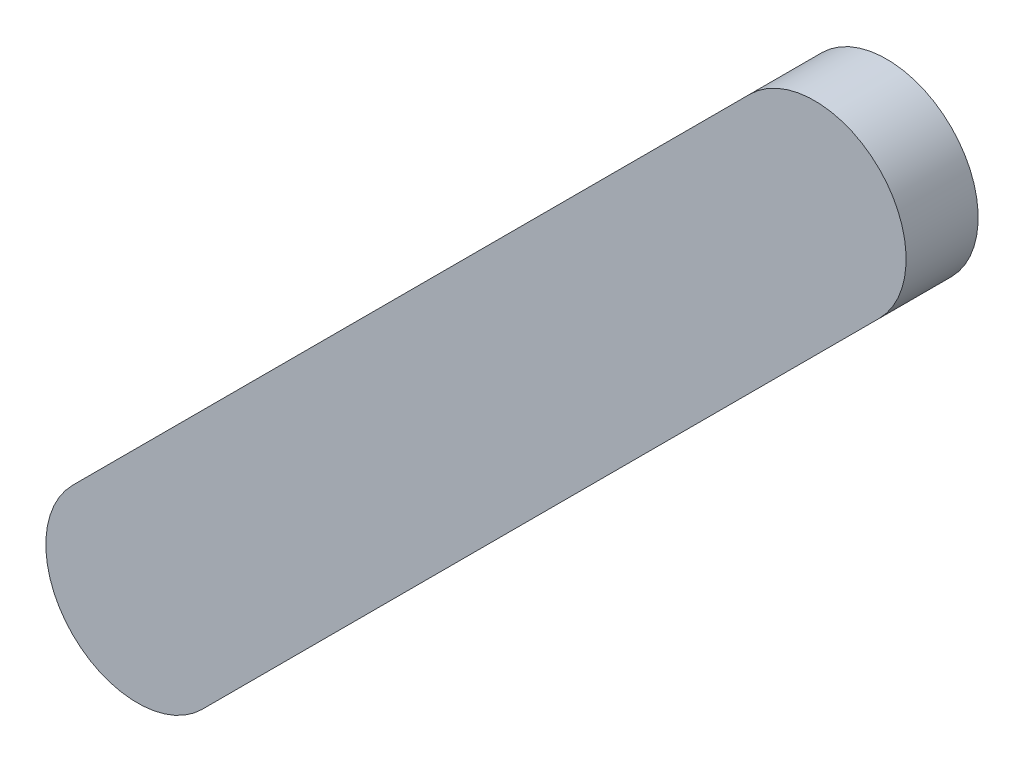
ISO-10303-21;
HEADER;
FILE_DESCRIPTION(('STEP AP214'),'2;1');
FILE_NAME('part.step','',(''),(''),'','','');
FILE_SCHEMA(('AUTOMOTIVE_DESIGN { 1 0 10303 214 1 1 1 1 }'));
ENDSEC;
DATA;
#1=APPLICATION_CONTEXT('core data for automotive mechanical design processes');
#2=APPLICATION_PROTOCOL_DEFINITION('international standard','automotive_design',2000,#1);
#3=PRODUCT_CONTEXT('',#1,'mechanical');
#4=PRODUCT('Part','Part','',(#3));
#5=PRODUCT_RELATED_PRODUCT_CATEGORY('part','',(#4));
#6=PRODUCT_DEFINITION_FORMATION('','',#4);
#7=PRODUCT_DEFINITION_CONTEXT('part definition',#1,'design');
#8=PRODUCT_DEFINITION('design','',#6,#7);
#9=PRODUCT_DEFINITION_SHAPE('','',#8);
#10=(LENGTH_UNIT() NAMED_UNIT(*) SI_UNIT(.MILLI.,.METRE.));
#11=(NAMED_UNIT(*) PLANE_ANGLE_UNIT() SI_UNIT($,.RADIAN.));
#12=(NAMED_UNIT(*) SI_UNIT($,.STERADIAN.) SOLID_ANGLE_UNIT());
#13=UNCERTAINTY_MEASURE_WITH_UNIT(LENGTH_MEASURE(1.E-05),#10,'distance_accuracy_value','');
#14=(GEOMETRIC_REPRESENTATION_CONTEXT(3) GLOBAL_UNCERTAINTY_ASSIGNED_CONTEXT((#13)) GLOBAL_UNIT_ASSIGNED_CONTEXT((#10,
#11,#12)) REPRESENTATION_CONTEXT('',''));
#15=CARTESIAN_POINT('',(0.,0.,0.));
#16=DIRECTION('',(0.,0.,1.));
#17=DIRECTION('',(1.,0.,0.));
#18=AXIS2_PLACEMENT_3D('',#15,#16,#17);
#19=CARTESIAN_POINT('',(114.73360594,51.00139406,0.));
#20=DIRECTION('',(-0.707106781186549,0.707106781186546,0.));
#21=DIRECTION('',(0.707106781186546,0.707106781186549,0.));
#22=AXIS2_PLACEMENT_3D('',#19,#20,#21);
#23=PLANE('',#22);
#24=DIRECTION('',(0.707106781186546,0.707106781186549,0.));
#25=VECTOR('',#24,1.);
#26=CARTESIAN_POINT('',(114.73360594,51.00139406,0.1999996));
#27=LINE('',#26,#25);
#28=CARTESIAN_POINT('',(114.73360594,51.00139406,0.1999996));
#29=VERTEX_POINT('',#28);
#30=CARTESIAN_POINT('',(116.61320594,52.88099406,0.1999996));
#31=VERTEX_POINT('',#30);
#32=EDGE_CURVE('E11',#29,#31,#27,.T.);
#33=ORIENTED_EDGE('',*,*,#32,.F.);
#34=DIRECTION('',(0.,0.,1.));
#35=VECTOR('',#34,1.);
#36=CARTESIAN_POINT('',(114.73360594,51.00139406,0.));
#37=LINE('',#36,#35);
#38=CARTESIAN_POINT('',(114.73360594,51.00139406,0.));
#39=VERTEX_POINT('',#38);
#40=EDGE_CURVE('E24',#39,#29,#37,.T.);
#41=ORIENTED_EDGE('',*,*,#40,.F.);
#42=DIRECTION('',(0.707106781186546,0.707106781186549,0.));
#43=VECTOR('',#42,1.);
#44=CARTESIAN_POINT('',(114.73360594,51.00139406,0.));
#45=LINE('',#44,#43);
#46=CARTESIAN_POINT('',(116.61320594,52.88099406,0.));
#47=VERTEX_POINT('',#46);
#48=EDGE_CURVE('E75',#39,#47,#45,.T.);
#49=ORIENTED_EDGE('',*,*,#48,.T.);
#50=DIRECTION('',(0.,0.,1.));
#51=VECTOR('',#50,1.);
#52=CARTESIAN_POINT('',(116.61320594,52.88099406,0.));
#53=LINE('',#52,#51);
#54=EDGE_CURVE('E37',#47,#31,#53,.T.);
#55=ORIENTED_EDGE('',*,*,#54,.T.);
#56=EDGE_LOOP('',(#33,#41,#49,#55));
#57=FACE_BOUND('',#56,.T.);
#58=ADVANCED_FACE('F17',(#57),#23,.F.);
#59=CARTESIAN_POINT('',(116.4336,53.0606,0.));
#60=DIRECTION('',(0.,0.,-1.));
#61=DIRECTION('',(0.707106781186548,-0.707106781186548,0.));
#62=AXIS2_PLACEMENT_3D('',#59,#60,#61);
#63=CYLINDRICAL_SURFACE('',#62,0.254001156230771);
#64=CARTESIAN_POINT('',(116.4336,53.0606,0.1999996));
#65=DIRECTION('',(0.,0.,1.));
#66=DIRECTION('',(0.707106781186548,-0.707106781186548,0.));
#67=AXIS2_PLACEMENT_3D('',#64,#65,#66);
#68=CIRCLE('',#67,0.254001156230771);
#69=CARTESIAN_POINT('',(116.25399406,53.24020594,0.1999996));
#70=VERTEX_POINT('',#69);
#71=EDGE_CURVE('E83',#31,#70,#68,.T.);
#72=ORIENTED_EDGE('',*,*,#71,.F.);
#73=ORIENTED_EDGE('',*,*,#54,.F.);
#74=CARTESIAN_POINT('',(116.4336,53.0606,0.));
#75=DIRECTION('',(0.,0.,1.));
#76=DIRECTION('',(0.707106781186548,-0.707106781186548,0.));
#77=AXIS2_PLACEMENT_3D('',#74,#75,#76);
#78=CIRCLE('',#77,0.254001156230771);
#79=CARTESIAN_POINT('',(116.25399406,53.24020594,0.));
#80=VERTEX_POINT('',#79);
#81=EDGE_CURVE('E81',#47,#80,#78,.T.);
#82=ORIENTED_EDGE('',*,*,#81,.T.);
#83=DIRECTION('',(0.,0.,1.));
#84=VECTOR('',#83,1.);
#85=CARTESIAN_POINT('',(116.25399406,53.24020594,0.));
#86=LINE('',#85,#84);
#87=EDGE_CURVE('E67',#80,#70,#86,.T.);
#88=ORIENTED_EDGE('',*,*,#87,.T.);
#89=EDGE_LOOP('',(#72,#73,#82,#88));
#90=FACE_BOUND('',#89,.T.);
#91=ADVANCED_FACE('F89',(#90),#63,.T.);
#92=CARTESIAN_POINT('',(116.25399406,53.24020594,0.));
#93=DIRECTION('',(0.707106781186549,-0.707106781186546,0.));
#94=DIRECTION('',(-0.707106781186546,-0.707106781186549,0.));
#95=AXIS2_PLACEMENT_3D('',#92,#93,#94);
#96=PLANE('',#95);
#97=DIRECTION('',(-0.707106781186546,-0.707106781186549,0.));
#98=VECTOR('',#97,1.);
#99=CARTESIAN_POINT('',(116.25399406,53.24020594,0.1999996));
#100=LINE('',#99,#98);
#101=CARTESIAN_POINT('',(114.37439406,51.36060594,0.1999996));
#102=VERTEX_POINT('',#101);
#103=EDGE_CURVE('E71',#70,#102,#100,.T.);
#104=ORIENTED_EDGE('',*,*,#103,.F.);
#105=ORIENTED_EDGE('',*,*,#87,.F.);
#106=DIRECTION('',(-0.707106781186546,-0.707106781186549,0.));
#107=VECTOR('',#106,1.);
#108=CARTESIAN_POINT('',(116.25399406,53.24020594,0.));
#109=LINE('',#108,#107);
#110=CARTESIAN_POINT('',(114.37439406,51.36060594,0.));
#111=VERTEX_POINT('',#110);
#112=EDGE_CURVE('E63',#80,#111,#109,.T.);
#113=ORIENTED_EDGE('',*,*,#112,.T.);
#114=DIRECTION('',(0.,0.,1.));
#115=VECTOR('',#114,1.);
#116=CARTESIAN_POINT('',(114.37439406,51.36060594,0.));
#117=LINE('',#116,#115);
#118=EDGE_CURVE('E53',#111,#102,#117,.T.);
#119=ORIENTED_EDGE('',*,*,#118,.T.);
#120=EDGE_LOOP('',(#104,#105,#113,#119));
#121=FACE_BOUND('',#120,.T.);
#122=ADVANCED_FACE('F66',(#121),#96,.F.);
#123=CARTESIAN_POINT('',(114.554,51.181,0.));
#124=DIRECTION('',(0.,0.,-1.));
#125=DIRECTION('',(-0.707106781186548,0.707106781186548,0.));
#126=AXIS2_PLACEMENT_3D('',#123,#124,#125);
#127=CYLINDRICAL_SURFACE('',#126,0.254001156230771);
#128=CARTESIAN_POINT('',(114.554,51.181,0.1999996));
#129=DIRECTION('',(0.,0.,1.));
#130=DIRECTION('',(-0.707106781186548,0.707106781186548,0.));
#131=AXIS2_PLACEMENT_3D('',#128,#129,#130);
#132=CIRCLE('',#131,0.254001156230771);
#133=EDGE_CURVE('E59',#102,#29,#132,.T.);
#134=ORIENTED_EDGE('',*,*,#133,.F.);
#135=ORIENTED_EDGE('',*,*,#118,.F.);
#136=CARTESIAN_POINT('',(114.554,51.181,0.));
#137=DIRECTION('',(0.,0.,1.));
#138=DIRECTION('',(-0.707106781186548,0.707106781186548,0.));
#139=AXIS2_PLACEMENT_3D('',#136,#137,#138);
#140=CIRCLE('',#139,0.254001156230771);
#141=EDGE_CURVE('E57',#111,#39,#140,.T.);
#142=ORIENTED_EDGE('',*,*,#141,.T.);
#143=ORIENTED_EDGE('',*,*,#40,.T.);
#144=EDGE_LOOP('',(#134,#135,#142,#143));
#145=FACE_BOUND('',#144,.T.);
#146=ADVANCED_FACE('F55',(#145),#127,.T.);
#147=CARTESIAN_POINT('',(114.73360594,51.00139406,0.));
#148=DIRECTION('',(0.,0.,-1.));
#149=DIRECTION('',(-1.,0.,0.));
#150=AXIS2_PLACEMENT_3D('',#147,#148,#149);
#151=PLANE('',#150);
#152=ORIENTED_EDGE('',*,*,#141,.F.);
#153=ORIENTED_EDGE('',*,*,#112,.F.);
#154=ORIENTED_EDGE('',*,*,#81,.F.);
#155=ORIENTED_EDGE('',*,*,#48,.F.);
#156=EDGE_LOOP('',(#152,#153,#154,#155));
#157=FACE_BOUND('',#156,.T.);
#158=ADVANCED_FACE('F74',(#157),#151,.T.);
#159=CARTESIAN_POINT('',(114.73360594,51.00139406,0.1999996));
#160=DIRECTION('',(0.,0.,-1.));
#161=DIRECTION('',(-1.,0.,0.));
#162=AXIS2_PLACEMENT_3D('',#159,#160,#161);
#163=PLANE('',#162);
#164=ORIENTED_EDGE('',*,*,#32,.T.);
#165=ORIENTED_EDGE('',*,*,#71,.T.);
#166=ORIENTED_EDGE('',*,*,#103,.T.);
#167=ORIENTED_EDGE('',*,*,#133,.T.);
#168=EDGE_LOOP('',(#164,#165,#166,#167));
#169=FACE_BOUND('',#168,.T.);
#170=ADVANCED_FACE('F91',(#169),#163,.F.);
#171=CLOSED_SHELL('',(#58,#91,#122,#146,#158,#170));
#172=MANIFOLD_SOLID_BREP('B1',#171);
#173=ADVANCED_BREP_SHAPE_REPRESENTATION('',(#18,#172),#14);
#174=SHAPE_DEFINITION_REPRESENTATION(#9,#173);
ENDSEC;
END-ISO-10303-21;
